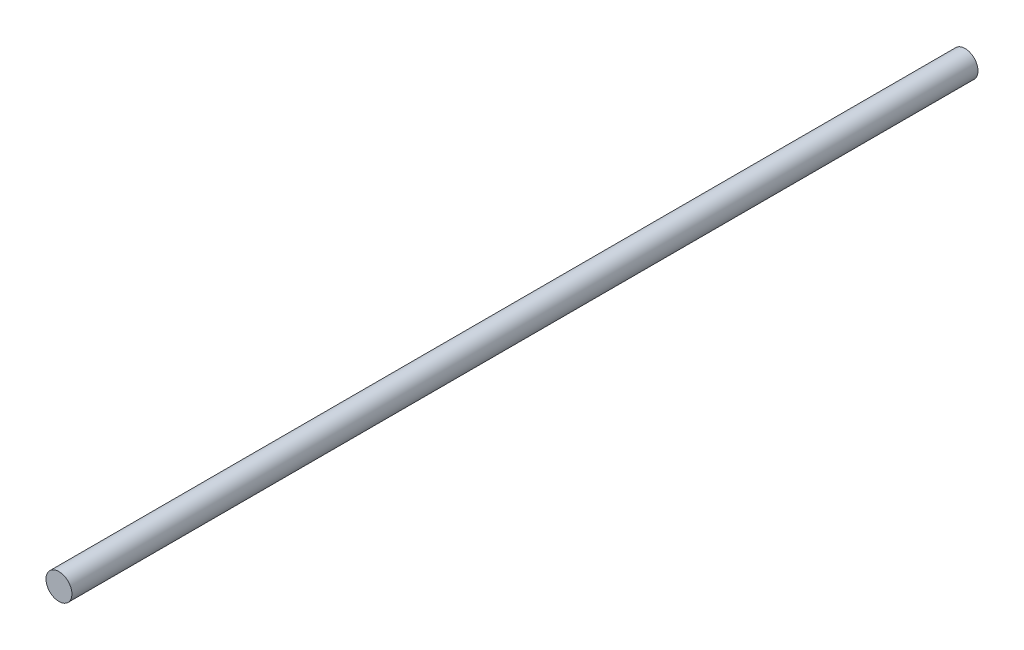
ISO-10303-21;
HEADER;
FILE_DESCRIPTION(('STEP AP214'),'2;1');
FILE_NAME('part.step','',(''),(''),'','','');
FILE_SCHEMA(('AUTOMOTIVE_DESIGN { 1 0 10303 214 1 1 1 1 }'));
ENDSEC;
DATA;
#1=APPLICATION_CONTEXT('core data for automotive mechanical design processes');
#2=APPLICATION_PROTOCOL_DEFINITION('international standard','automotive_design',2000,#1);
#3=PRODUCT_CONTEXT('',#1,'mechanical');
#4=PRODUCT('Part','Part','',(#3));
#5=PRODUCT_RELATED_PRODUCT_CATEGORY('part','',(#4));
#6=PRODUCT_DEFINITION_FORMATION('','',#4);
#7=PRODUCT_DEFINITION_CONTEXT('part definition',#1,'design');
#8=PRODUCT_DEFINITION('design','',#6,#7);
#9=PRODUCT_DEFINITION_SHAPE('','',#8);
#10=(LENGTH_UNIT() NAMED_UNIT(*) SI_UNIT(.MILLI.,.METRE.));
#11=(NAMED_UNIT(*) PLANE_ANGLE_UNIT() SI_UNIT($,.RADIAN.));
#12=(NAMED_UNIT(*) SI_UNIT($,.STERADIAN.) SOLID_ANGLE_UNIT());
#13=UNCERTAINTY_MEASURE_WITH_UNIT(LENGTH_MEASURE(1.E-05),#10,'distance_accuracy_value','');
#14=(GEOMETRIC_REPRESENTATION_CONTEXT(3) GLOBAL_UNCERTAINTY_ASSIGNED_CONTEXT((#13)) GLOBAL_UNIT_ASSIGNED_CONTEXT((#10,
#11,#12)) REPRESENTATION_CONTEXT('',''));
#15=CARTESIAN_POINT('',(0.,0.,0.));
#16=DIRECTION('',(0.,0.,1.));
#17=DIRECTION('',(1.,0.,0.));
#18=AXIS2_PLACEMENT_3D('',#15,#16,#17);
#19=CARTESIAN_POINT('',(0.,0.,22.352));
#20=DIRECTION('',(0.,0.,-1.));
#21=DIRECTION('',(-1.,0.,0.));
#22=AXIS2_PLACEMENT_3D('',#19,#20,#21);
#23=CYLINDRICAL_SURFACE('',#22,0.3200019);
#24=CARTESIAN_POINT('',(0.,0.,22.352));
#25=DIRECTION('',(0.,0.,1.));
#26=DIRECTION('',(1.,0.,0.));
#27=AXIS2_PLACEMENT_3D('',#24,#25,#26);
#28=CIRCLE('',#27,0.3200019);
#29=CARTESIAN_POINT('',(0.3200019,0.,22.352));
#30=VERTEX_POINT('',#29);
#31=EDGE_CURVE('E10',#30,#30,#28,.T.);
#32=ORIENTED_EDGE('',*,*,#31,.F.);
#33=EDGE_LOOP('',(#32));
#34=FACE_BOUND('',#33,.T.);
#35=CARTESIAN_POINT('',(0.,0.,0.));
#36=DIRECTION('',(0.,0.,1.));
#37=DIRECTION('',(1.,0.,0.));
#38=AXIS2_PLACEMENT_3D('',#35,#36,#37);
#39=CIRCLE('',#38,0.3200019);
#40=CARTESIAN_POINT('',(0.3200019,0.,0.));
#41=VERTEX_POINT('',#40);
#42=EDGE_CURVE('E36',#41,#41,#39,.T.);
#43=ORIENTED_EDGE('',*,*,#42,.T.);
#44=EDGE_LOOP('',(#43));
#45=FACE_BOUND('',#44,.T.);
#46=ADVANCED_FACE('F33',(#34,#45),#23,.T.);
#47=CARTESIAN_POINT('',(0.,0.,22.352));
#48=DIRECTION('',(0.,0.,1.));
#49=DIRECTION('',(1.,0.,0.));
#50=AXIS2_PLACEMENT_3D('',#47,#48,#49);
#51=PLANE('',#50);
#52=ORIENTED_EDGE('',*,*,#31,.T.);
#53=EDGE_LOOP('',(#52));
#54=FACE_BOUND('',#53,.T.);
#55=ADVANCED_FACE('F48',(#54),#51,.T.);
#56=CARTESIAN_POINT('',(0.,0.,0.));
#57=DIRECTION('',(0.,0.,1.));
#58=DIRECTION('',(1.,0.,0.));
#59=AXIS2_PLACEMENT_3D('',#56,#57,#58);
#60=PLANE('',#59);
#61=ORIENTED_EDGE('',*,*,#42,.F.);
#62=EDGE_LOOP('',(#61));
#63=FACE_BOUND('',#62,.T.);
#64=ADVANCED_FACE('F46',(#63),#60,.F.);
#65=CLOSED_SHELL('',(#46,#55,#64));
#66=MANIFOLD_SOLID_BREP('B2',#65);
#67=ADVANCED_BREP_SHAPE_REPRESENTATION('',(#18,#66),#14);
#68=SHAPE_DEFINITION_REPRESENTATION(#9,#67);
ENDSEC;
END-ISO-10303-21;
